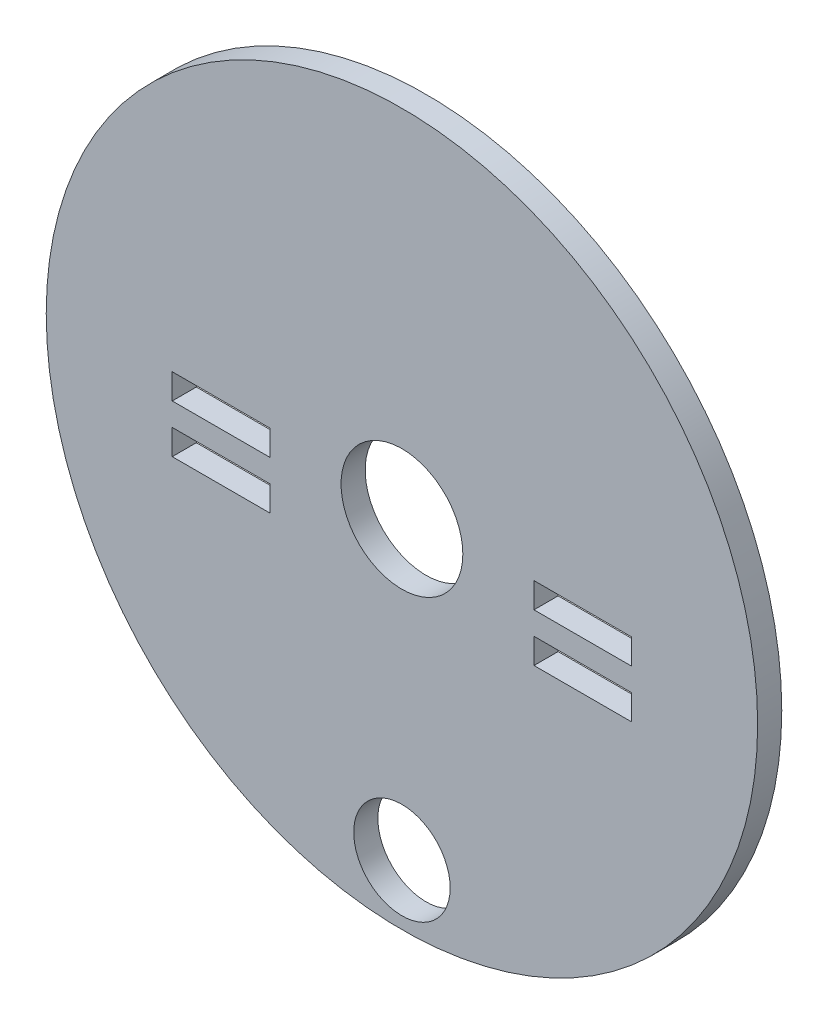
ISO-10303-21;
HEADER;
FILE_DESCRIPTION(('STEP AP214'),'2;1');
FILE_NAME('part.step','',(''),(''),'','','');
FILE_SCHEMA(('AUTOMOTIVE_DESIGN { 1 0 10303 214 1 1 1 1 }'));
ENDSEC;
DATA;
#1=APPLICATION_CONTEXT('core data for automotive mechanical design processes');
#2=APPLICATION_PROTOCOL_DEFINITION('international standard','automotive_design',2000,#1);
#3=PRODUCT_CONTEXT('',#1,'mechanical');
#4=PRODUCT('Part','Part','',(#3));
#5=PRODUCT_RELATED_PRODUCT_CATEGORY('part','',(#4));
#6=PRODUCT_DEFINITION_FORMATION('','',#4);
#7=PRODUCT_DEFINITION_CONTEXT('part definition',#1,'design');
#8=PRODUCT_DEFINITION('design','',#6,#7);
#9=PRODUCT_DEFINITION_SHAPE('','',#8);
#10=(LENGTH_UNIT() NAMED_UNIT(*) SI_UNIT(.MILLI.,.METRE.));
#11=(NAMED_UNIT(*) PLANE_ANGLE_UNIT() SI_UNIT($,.RADIAN.));
#12=(NAMED_UNIT(*) SI_UNIT($,.STERADIAN.) SOLID_ANGLE_UNIT());
#13=UNCERTAINTY_MEASURE_WITH_UNIT(LENGTH_MEASURE(1.E-05),#10,'distance_accuracy_value','');
#14=(GEOMETRIC_REPRESENTATION_CONTEXT(3) GLOBAL_UNCERTAINTY_ASSIGNED_CONTEXT((#13)) GLOBAL_UNIT_ASSIGNED_CONTEXT((#10,
#11,#12)) REPRESENTATION_CONTEXT('',''));
#15=CARTESIAN_POINT('',(0.,0.,0.));
#16=DIRECTION('',(0.,0.,1.));
#17=DIRECTION('',(1.,0.,0.));
#18=AXIS2_PLACEMENT_3D('',#15,#16,#17);
#19=CARTESIAN_POINT('',(0.,4.,2.));
#20=DIRECTION('',(0.,0.,1.));
#21=DIRECTION('',(1.,0.,0.));
#22=AXIS2_PLACEMENT_3D('',#19,#20,#21);
#23=PLANE('',#22);
#24=CARTESIAN_POINT('',(0.,-20.5,2.));
#25=DIRECTION('',(0.,0.,1.));
#26=DIRECTION('',(1.,0.,0.));
#27=AXIS2_PLACEMENT_3D('',#24,#25,#26);
#28=CIRCLE('',#27,4.);
#29=CARTESIAN_POINT('',(4.,-20.5,2.));
#30=VERTEX_POINT('',#29);
#31=EDGE_CURVE('E177',#30,#30,#28,.T.);
#32=ORIENTED_EDGE('',*,*,#31,.F.);
#33=EDGE_LOOP('',(#32));
#34=FACE_BOUND('',#33,.T.);
#35=CARTESIAN_POINT('',(0.,4.,2.));
#36=DIRECTION('',(0.,0.,1.));
#37=DIRECTION('',(1.,0.,0.));
#38=AXIS2_PLACEMENT_3D('',#35,#36,#37);
#39=CIRCLE('',#38,29.5);
#40=CARTESIAN_POINT('',(29.5,4.,2.));
#41=VERTEX_POINT('',#40);
#42=EDGE_CURVE('E11',#41,#41,#39,.T.);
#43=ORIENTED_EDGE('',*,*,#42,.T.);
#44=EDGE_LOOP('',(#43));
#45=FACE_BOUND('',#44,.T.);
#46=DIRECTION('',(-1.,0.,0.));
#47=VECTOR('',#46,1.);
#48=CARTESIAN_POINT('',(-19.05,5.05,2.));
#49=LINE('',#48,#47);
#50=CARTESIAN_POINT('',(-10.95,5.05,2.));
#51=VERTEX_POINT('',#50);
#52=CARTESIAN_POINT('',(-19.05,5.05,2.));
#53=VERTEX_POINT('',#52);
#54=EDGE_CURVE('E251',#51,#53,#49,.T.);
#55=ORIENTED_EDGE('',*,*,#54,.F.);
#56=DIRECTION('',(0.,1.,0.));
#57=VECTOR('',#56,1.);
#58=CARTESIAN_POINT('',(-10.95,5.05,2.));
#59=LINE('',#58,#57);
#60=CARTESIAN_POINT('',(-10.95,2.95,2.));
#61=VERTEX_POINT('',#60);
#62=EDGE_CURVE('E249',#61,#51,#59,.T.);
#63=ORIENTED_EDGE('',*,*,#62,.F.);
#64=DIRECTION('',(1.,0.,0.));
#65=VECTOR('',#64,1.);
#66=CARTESIAN_POINT('',(-19.05,2.95,2.));
#67=LINE('',#66,#65);
#68=CARTESIAN_POINT('',(-19.05,2.95,2.));
#69=VERTEX_POINT('',#68);
#70=EDGE_CURVE('E257',#69,#61,#67,.T.);
#71=ORIENTED_EDGE('',*,*,#70,.F.);
#72=DIRECTION('',(0.,-1.,0.));
#73=VECTOR('',#72,1.);
#74=CARTESIAN_POINT('',(-19.05,5.05,2.));
#75=LINE('',#74,#73);
#76=EDGE_CURVE('E254',#53,#69,#75,.T.);
#77=ORIENTED_EDGE('',*,*,#76,.F.);
#78=EDGE_LOOP('',(#55,#63,#71,#77));
#79=FACE_BOUND('',#78,.T.);
#80=DIRECTION('',(0.,1.,0.));
#81=VECTOR('',#80,1.);
#82=CARTESIAN_POINT('',(-10.95,-1.05,2.));
#83=LINE('',#82,#81);
#84=CARTESIAN_POINT('',(-10.95,-1.05,2.));
#85=VERTEX_POINT('',#84);
#86=CARTESIAN_POINT('',(-10.95,1.05,2.));
#87=VERTEX_POINT('',#86);
#88=EDGE_CURVE('E220',#85,#87,#83,.T.);
#89=ORIENTED_EDGE('',*,*,#88,.F.);
#90=DIRECTION('',(1.,0.,0.));
#91=VECTOR('',#90,1.);
#92=CARTESIAN_POINT('',(-19.05,-1.05,2.));
#93=LINE('',#92,#91);
#94=CARTESIAN_POINT('',(-19.05,-1.05,2.));
#95=VERTEX_POINT('',#94);
#96=EDGE_CURVE('E218',#95,#85,#93,.T.);
#97=ORIENTED_EDGE('',*,*,#96,.F.);
#98=DIRECTION('',(0.,-1.,0.));
#99=VECTOR('',#98,1.);
#100=CARTESIAN_POINT('',(-19.05,-1.05,2.));
#101=LINE('',#100,#99);
#102=CARTESIAN_POINT('',(-19.05,1.05,2.));
#103=VERTEX_POINT('',#102);
#104=EDGE_CURVE('E226',#103,#95,#101,.T.);
#105=ORIENTED_EDGE('',*,*,#104,.F.);
#106=DIRECTION('',(-1.,0.,0.));
#107=VECTOR('',#106,1.);
#108=CARTESIAN_POINT('',(-19.05,1.05,2.));
#109=LINE('',#108,#107);
#110=EDGE_CURVE('E223',#87,#103,#109,.T.);
#111=ORIENTED_EDGE('',*,*,#110,.F.);
#112=EDGE_LOOP('',(#89,#97,#105,#111));
#113=FACE_BOUND('',#112,.T.);
#114=DIRECTION('',(0.,-1.,0.));
#115=VECTOR('',#114,1.);
#116=CARTESIAN_POINT('',(10.95,5.05,2.));
#117=LINE('',#116,#115);
#118=CARTESIAN_POINT('',(10.95,5.05,2.));
#119=VERTEX_POINT('',#118);
#120=CARTESIAN_POINT('',(10.95,2.95,2.));
#121=VERTEX_POINT('',#120);
#122=EDGE_CURVE('E189',#119,#121,#117,.T.);
#123=ORIENTED_EDGE('',*,*,#122,.F.);
#124=DIRECTION('',(-1.,0.,0.));
#125=VECTOR('',#124,1.);
#126=CARTESIAN_POINT('',(19.05,5.05000000000001,2.));
#127=LINE('',#126,#125);
#128=CARTESIAN_POINT('',(19.05,5.05000000000001,2.));
#129=VERTEX_POINT('',#128);
#130=EDGE_CURVE('E187',#129,#119,#127,.T.);
#131=ORIENTED_EDGE('',*,*,#130,.F.);
#132=DIRECTION('',(0.,1.,0.));
#133=VECTOR('',#132,1.);
#134=CARTESIAN_POINT('',(19.05,5.05000000000001,2.));
#135=LINE('',#134,#133);
#136=CARTESIAN_POINT('',(19.05,2.95000000000001,2.));
#137=VERTEX_POINT('',#136);
#138=EDGE_CURVE('E195',#137,#129,#135,.T.);
#139=ORIENTED_EDGE('',*,*,#138,.F.);
#140=DIRECTION('',(1.,0.,0.));
#141=VECTOR('',#140,1.);
#142=CARTESIAN_POINT('',(19.05,2.95000000000001,2.));
#143=LINE('',#142,#141);
#144=EDGE_CURVE('E192',#121,#137,#143,.T.);
#145=ORIENTED_EDGE('',*,*,#144,.F.);
#146=EDGE_LOOP('',(#123,#131,#139,#145));
#147=FACE_BOUND('',#146,.T.);
#148=DIRECTION('',(-1.,0.,0.));
#149=VECTOR('',#148,1.);
#150=CARTESIAN_POINT('',(19.05,1.05,2.));
#151=LINE('',#150,#149);
#152=CARTESIAN_POINT('',(19.05,1.05,2.));
#153=VERTEX_POINT('',#152);
#154=CARTESIAN_POINT('',(10.95,1.05,2.));
#155=VERTEX_POINT('',#154);
#156=EDGE_CURVE('E156',#153,#155,#151,.T.);
#157=ORIENTED_EDGE('',*,*,#156,.F.);
#158=DIRECTION('',(0.,1.,0.));
#159=VECTOR('',#158,1.);
#160=CARTESIAN_POINT('',(19.05,-1.05,2.));
#161=LINE('',#160,#159);
#162=CARTESIAN_POINT('',(19.05,-1.05,2.));
#163=VERTEX_POINT('',#162);
#164=EDGE_CURVE('E148',#163,#153,#161,.T.);
#165=ORIENTED_EDGE('',*,*,#164,.F.);
#166=DIRECTION('',(1.,0.,0.));
#167=VECTOR('',#166,1.);
#168=CARTESIAN_POINT('',(19.05,-1.05,2.));
#169=LINE('',#168,#167);
#170=CARTESIAN_POINT('',(10.95,-1.05,2.));
#171=VERTEX_POINT('',#170);
#172=EDGE_CURVE('E171',#171,#163,#169,.T.);
#173=ORIENTED_EDGE('',*,*,#172,.F.);
#174=DIRECTION('',(0.,-1.,0.));
#175=VECTOR('',#174,1.);
#176=CARTESIAN_POINT('',(10.95,-1.05,2.));
#177=LINE('',#176,#175);
#178=EDGE_CURVE('E169',#155,#171,#177,.T.);
#179=ORIENTED_EDGE('',*,*,#178,.F.);
#180=EDGE_LOOP('',(#157,#165,#173,#179));
#181=FACE_BOUND('',#180,.T.);
#182=CARTESIAN_POINT('',(0.,4.,2.));
#183=DIRECTION('',(0.,0.,1.));
#184=DIRECTION('',(1.,0.,0.));
#185=AXIS2_PLACEMENT_3D('',#182,#183,#184);
#186=CIRCLE('',#185,5.05);
#187=CARTESIAN_POINT('',(5.05,4.,2.));
#188=VERTEX_POINT('',#187);
#189=EDGE_CURVE('E298',#188,#188,#186,.T.);
#190=ORIENTED_EDGE('',*,*,#189,.F.);
#191=EDGE_LOOP('',(#190));
#192=FACE_BOUND('',#191,.T.);
#193=ADVANCED_FACE('F35',(#34,#45,#79,#113,#147,#181,#192),#23,.T.);
#194=CARTESIAN_POINT('',(0.,4.,0.));
#195=DIRECTION('',(0.,0.,1.));
#196=DIRECTION('',(1.,0.,0.));
#197=AXIS2_PLACEMENT_3D('',#194,#195,#196);
#198=PLANE('',#197);
#199=DIRECTION('',(-1.,0.,0.));
#200=VECTOR('',#199,1.);
#201=CARTESIAN_POINT('',(19.05,5.05000000000001,0.));
#202=LINE('',#201,#200);
#203=CARTESIAN_POINT('',(19.05,5.05000000000001,0.));
#204=VERTEX_POINT('',#203);
#205=CARTESIAN_POINT('',(10.95,5.05,0.));
#206=VERTEX_POINT('',#205);
#207=EDGE_CURVE('E164',#204,#206,#202,.T.);
#208=ORIENTED_EDGE('',*,*,#207,.T.);
#209=DIRECTION('',(0.,-1.,0.));
#210=VECTOR('',#209,1.);
#211=CARTESIAN_POINT('',(10.95,5.05,0.));
#212=LINE('',#211,#210);
#213=CARTESIAN_POINT('',(10.95,2.95,0.));
#214=VERTEX_POINT('',#213);
#215=EDGE_CURVE('E200',#206,#214,#212,.T.);
#216=ORIENTED_EDGE('',*,*,#215,.T.);
#217=DIRECTION('',(1.,0.,0.));
#218=VECTOR('',#217,1.);
#219=CARTESIAN_POINT('',(19.05,2.95000000000001,0.));
#220=LINE('',#219,#218);
#221=CARTESIAN_POINT('',(19.05,2.95000000000001,0.));
#222=VERTEX_POINT('',#221);
#223=EDGE_CURVE('E203',#214,#222,#220,.T.);
#224=ORIENTED_EDGE('',*,*,#223,.T.);
#225=DIRECTION('',(0.,1.,0.));
#226=VECTOR('',#225,1.);
#227=CARTESIAN_POINT('',(19.05,5.05000000000001,0.));
#228=LINE('',#227,#226);
#229=EDGE_CURVE('E190',#222,#204,#228,.T.);
#230=ORIENTED_EDGE('',*,*,#229,.T.);
#231=EDGE_LOOP('',(#208,#216,#224,#230));
#232=FACE_BOUND('',#231,.T.);
#233=DIRECTION('',(0.,1.,0.));
#234=VECTOR('',#233,1.);
#235=CARTESIAN_POINT('',(-10.95,5.05,0.));
#236=LINE('',#235,#234);
#237=CARTESIAN_POINT('',(-10.95,2.95,0.));
#238=VERTEX_POINT('',#237);
#239=CARTESIAN_POINT('',(-10.95,5.05,0.));
#240=VERTEX_POINT('',#239);
#241=EDGE_CURVE('E248',#238,#240,#236,.T.);
#242=ORIENTED_EDGE('',*,*,#241,.T.);
#243=DIRECTION('',(-1.,0.,0.));
#244=VECTOR('',#243,1.);
#245=CARTESIAN_POINT('',(-19.05,5.05,0.));
#246=LINE('',#245,#244);
#247=CARTESIAN_POINT('',(-19.05,5.05,0.));
#248=VERTEX_POINT('',#247);
#249=EDGE_CURVE('E262',#240,#248,#246,.T.);
#250=ORIENTED_EDGE('',*,*,#249,.T.);
#251=DIRECTION('',(0.,-1.,0.));
#252=VECTOR('',#251,1.);
#253=CARTESIAN_POINT('',(-19.05,5.05,0.));
#254=LINE('',#253,#252);
#255=CARTESIAN_POINT('',(-19.05,2.95,0.));
#256=VERTEX_POINT('',#255);
#257=EDGE_CURVE('E265',#248,#256,#254,.T.);
#258=ORIENTED_EDGE('',*,*,#257,.T.);
#259=DIRECTION('',(1.,0.,0.));
#260=VECTOR('',#259,1.);
#261=CARTESIAN_POINT('',(-19.05,2.95,0.));
#262=LINE('',#261,#260);
#263=EDGE_CURVE('E252',#256,#238,#262,.T.);
#264=ORIENTED_EDGE('',*,*,#263,.T.);
#265=EDGE_LOOP('',(#242,#250,#258,#264));
#266=FACE_BOUND('',#265,.T.);
#267=CARTESIAN_POINT('',(0.,4.,0.));
#268=DIRECTION('',(0.,0.,1.));
#269=DIRECTION('',(1.,0.,0.));
#270=AXIS2_PLACEMENT_3D('',#267,#268,#269);
#271=CIRCLE('',#270,29.5);
#272=CARTESIAN_POINT('',(29.5,4.,0.));
#273=VERTEX_POINT('',#272);
#274=EDGE_CURVE('E39',#273,#273,#271,.T.);
#275=ORIENTED_EDGE('',*,*,#274,.F.);
#276=EDGE_LOOP('',(#275));
#277=FACE_BOUND('',#276,.T.);
#278=DIRECTION('',(1.,0.,0.));
#279=VECTOR('',#278,1.);
#280=CARTESIAN_POINT('',(-19.05,-1.05,0.));
#281=LINE('',#280,#279);
#282=CARTESIAN_POINT('',(-19.05,-1.05,0.));
#283=VERTEX_POINT('',#282);
#284=CARTESIAN_POINT('',(-10.95,-1.05,0.));
#285=VERTEX_POINT('',#284);
#286=EDGE_CURVE('E217',#283,#285,#281,.T.);
#287=ORIENTED_EDGE('',*,*,#286,.T.);
#288=DIRECTION('',(0.,1.,0.));
#289=VECTOR('',#288,1.);
#290=CARTESIAN_POINT('',(-10.95,-1.05,0.));
#291=LINE('',#290,#289);
#292=CARTESIAN_POINT('',(-10.95,1.05,0.));
#293=VERTEX_POINT('',#292);
#294=EDGE_CURVE('E231',#285,#293,#291,.T.);
#295=ORIENTED_EDGE('',*,*,#294,.T.);
#296=DIRECTION('',(-1.,0.,0.));
#297=VECTOR('',#296,1.);
#298=CARTESIAN_POINT('',(-19.05,1.05,0.));
#299=LINE('',#298,#297);
#300=CARTESIAN_POINT('',(-19.05,1.05,0.));
#301=VERTEX_POINT('',#300);
#302=EDGE_CURVE('E234',#293,#301,#299,.T.);
#303=ORIENTED_EDGE('',*,*,#302,.T.);
#304=DIRECTION('',(0.,-1.,0.));
#305=VECTOR('',#304,1.);
#306=CARTESIAN_POINT('',(-19.05,-1.05,0.));
#307=LINE('',#306,#305);
#308=EDGE_CURVE('E221',#301,#283,#307,.T.);
#309=ORIENTED_EDGE('',*,*,#308,.T.);
#310=EDGE_LOOP('',(#287,#295,#303,#309));
#311=FACE_BOUND('',#310,.T.);
#312=DIRECTION('',(0.,1.,0.));
#313=VECTOR('',#312,1.);
#314=CARTESIAN_POINT('',(19.05,-1.05,0.));
#315=LINE('',#314,#313);
#316=CARTESIAN_POINT('',(19.05,-1.05,0.));
#317=VERTEX_POINT('',#316);
#318=CARTESIAN_POINT('',(19.05,1.05,0.));
#319=VERTEX_POINT('',#318);
#320=EDGE_CURVE('E58',#317,#319,#315,.T.);
#321=ORIENTED_EDGE('',*,*,#320,.T.);
#322=DIRECTION('',(-1.,0.,0.));
#323=VECTOR('',#322,1.);
#324=CARTESIAN_POINT('',(19.05,1.05,0.));
#325=LINE('',#324,#323);
#326=CARTESIAN_POINT('',(10.95,1.05,0.));
#327=VERTEX_POINT('',#326);
#328=EDGE_CURVE('E163',#319,#327,#325,.T.);
#329=ORIENTED_EDGE('',*,*,#328,.T.);
#330=DIRECTION('',(0.,-1.,0.));
#331=VECTOR('',#330,1.);
#332=CARTESIAN_POINT('',(10.95,-1.05,0.));
#333=LINE('',#332,#331);
#334=CARTESIAN_POINT('',(10.95,-1.05,0.));
#335=VERTEX_POINT('',#334);
#336=EDGE_CURVE('E179',#327,#335,#333,.T.);
#337=ORIENTED_EDGE('',*,*,#336,.T.);
#338=DIRECTION('',(1.,0.,0.));
#339=VECTOR('',#338,1.);
#340=CARTESIAN_POINT('',(19.05,-1.05,0.));
#341=LINE('',#340,#339);
#342=EDGE_CURVE('E157',#335,#317,#341,.T.);
#343=ORIENTED_EDGE('',*,*,#342,.T.);
#344=EDGE_LOOP('',(#321,#329,#337,#343));
#345=FACE_BOUND('',#344,.T.);
#346=CARTESIAN_POINT('',(0.,-20.5,0.));
#347=DIRECTION('',(0.,0.,1.));
#348=DIRECTION('',(1.,0.,0.));
#349=AXIS2_PLACEMENT_3D('',#346,#347,#348);
#350=CIRCLE('',#349,4.);
#351=CARTESIAN_POINT('',(4.,-20.5,0.));
#352=VERTEX_POINT('',#351);
#353=EDGE_CURVE('E293',#352,#352,#350,.T.);
#354=ORIENTED_EDGE('',*,*,#353,.T.);
#355=EDGE_LOOP('',(#354));
#356=FACE_BOUND('',#355,.T.);
#357=CARTESIAN_POINT('',(0.,4.,0.));
#358=DIRECTION('',(0.,0.,1.));
#359=DIRECTION('',(1.,0.,0.));
#360=AXIS2_PLACEMENT_3D('',#357,#358,#359);
#361=CIRCLE('',#360,5.05);
#362=CARTESIAN_POINT('',(5.05,4.,0.));
#363=VERTEX_POINT('',#362);
#364=EDGE_CURVE('E296',#363,#363,#361,.T.);
#365=ORIENTED_EDGE('',*,*,#364,.T.);
#366=EDGE_LOOP('',(#365));
#367=FACE_BOUND('',#366,.T.);
#368=ADVANCED_FACE('F284',(#232,#266,#277,#311,#345,#356,#367),#198,.F.);
#369=CARTESIAN_POINT('',(0.,4.,2.));
#370=DIRECTION('',(0.,0.,-1.));
#371=DIRECTION('',(-1.,0.,0.));
#372=AXIS2_PLACEMENT_3D('',#369,#370,#371);
#373=CYLINDRICAL_SURFACE('',#372,29.5);
#374=ORIENTED_EDGE('',*,*,#42,.F.);
#375=EDGE_LOOP('',(#374));
#376=FACE_BOUND('',#375,.T.);
#377=ORIENTED_EDGE('',*,*,#274,.T.);
#378=EDGE_LOOP('',(#377));
#379=FACE_BOUND('',#378,.T.);
#380=ADVANCED_FACE('F37',(#376,#379),#373,.T.);
#381=CARTESIAN_POINT('',(-10.95,5.05,2.));
#382=DIRECTION('',(-1.,0.,0.));
#383=DIRECTION('',(0.,0.,1.));
#384=AXIS2_PLACEMENT_3D('',#381,#382,#383);
#385=PLANE('',#384);
#386=ORIENTED_EDGE('',*,*,#241,.F.);
#387=DIRECTION('',(0.,0.,-1.));
#388=VECTOR('',#387,1.);
#389=CARTESIAN_POINT('',(-10.95,2.95,2.));
#390=LINE('',#389,#388);
#391=EDGE_CURVE('E259',#61,#238,#390,.T.);
#392=ORIENTED_EDGE('',*,*,#391,.F.);
#393=ORIENTED_EDGE('',*,*,#62,.T.);
#394=DIRECTION('',(0.,0.,-1.));
#395=VECTOR('',#394,1.);
#396=CARTESIAN_POINT('',(-10.95,5.05,2.));
#397=LINE('',#396,#395);
#398=EDGE_CURVE('E276',#51,#240,#397,.T.);
#399=ORIENTED_EDGE('',*,*,#398,.T.);
#400=EDGE_LOOP('',(#386,#392,#393,#399));
#401=FACE_BOUND('',#400,.T.);
#402=ADVANCED_FACE('F381',(#401),#385,.T.);
#403=CARTESIAN_POINT('',(-19.05,5.05,2.));
#404=DIRECTION('',(0.,-1.,0.));
#405=DIRECTION('',(0.,0.,-1.));
#406=AXIS2_PLACEMENT_3D('',#403,#404,#405);
#407=PLANE('',#406);
#408=ORIENTED_EDGE('',*,*,#249,.F.);
#409=ORIENTED_EDGE('',*,*,#398,.F.);
#410=ORIENTED_EDGE('',*,*,#54,.T.);
#411=DIRECTION('',(0.,0.,-1.));
#412=VECTOR('',#411,1.);
#413=CARTESIAN_POINT('',(-19.05,5.05,2.));
#414=LINE('',#413,#412);
#415=EDGE_CURVE('E274',#53,#248,#414,.T.);
#416=ORIENTED_EDGE('',*,*,#415,.T.);
#417=EDGE_LOOP('',(#408,#409,#410,#416));
#418=FACE_BOUND('',#417,.T.);
#419=ADVANCED_FACE('F377',(#418),#407,.T.);
#420=CARTESIAN_POINT('',(-19.05,5.05,2.));
#421=DIRECTION('',(1.,0.,0.));
#422=DIRECTION('',(0.,0.,-1.));
#423=AXIS2_PLACEMENT_3D('',#420,#421,#422);
#424=PLANE('',#423);
#425=ORIENTED_EDGE('',*,*,#257,.F.);
#426=ORIENTED_EDGE('',*,*,#415,.F.);
#427=ORIENTED_EDGE('',*,*,#76,.T.);
#428=DIRECTION('',(0.,0.,-1.));
#429=VECTOR('',#428,1.);
#430=CARTESIAN_POINT('',(-19.05,2.95,2.));
#431=LINE('',#430,#429);
#432=EDGE_CURVE('E272',#69,#256,#431,.T.);
#433=ORIENTED_EDGE('',*,*,#432,.T.);
#434=EDGE_LOOP('',(#425,#426,#427,#433));
#435=FACE_BOUND('',#434,.T.);
#436=ADVANCED_FACE('F373',(#435),#424,.T.);
#437=CARTESIAN_POINT('',(-19.05,2.95,2.));
#438=DIRECTION('',(0.,1.,0.));
#439=DIRECTION('',(0.,0.,1.));
#440=AXIS2_PLACEMENT_3D('',#437,#438,#439);
#441=PLANE('',#440);
#442=ORIENTED_EDGE('',*,*,#263,.F.);
#443=ORIENTED_EDGE('',*,*,#432,.F.);
#444=ORIENTED_EDGE('',*,*,#70,.T.);
#445=ORIENTED_EDGE('',*,*,#391,.T.);
#446=EDGE_LOOP('',(#442,#443,#444,#445));
#447=FACE_BOUND('',#446,.T.);
#448=ADVANCED_FACE('F369',(#447),#441,.T.);
#449=CARTESIAN_POINT('',(-19.05,-1.05,2.));
#450=DIRECTION('',(0.,1.,0.));
#451=DIRECTION('',(0.,0.,1.));
#452=AXIS2_PLACEMENT_3D('',#449,#450,#451);
#453=PLANE('',#452);
#454=ORIENTED_EDGE('',*,*,#286,.F.);
#455=DIRECTION('',(0.,0.,-1.));
#456=VECTOR('',#455,1.);
#457=CARTESIAN_POINT('',(-19.05,-1.05,2.));
#458=LINE('',#457,#456);
#459=EDGE_CURVE('E228',#95,#283,#458,.T.);
#460=ORIENTED_EDGE('',*,*,#459,.F.);
#461=ORIENTED_EDGE('',*,*,#96,.T.);
#462=DIRECTION('',(0.,0.,-1.));
#463=VECTOR('',#462,1.);
#464=CARTESIAN_POINT('',(-10.95,-1.05,2.));
#465=LINE('',#464,#463);
#466=EDGE_CURVE('E245',#85,#285,#465,.T.);
#467=ORIENTED_EDGE('',*,*,#466,.T.);
#468=EDGE_LOOP('',(#454,#460,#461,#467));
#469=FACE_BOUND('',#468,.T.);
#470=ADVANCED_FACE('F365',(#469),#453,.T.);
#471=CARTESIAN_POINT('',(-10.95,-1.05,2.));
#472=DIRECTION('',(-1.,0.,0.));
#473=DIRECTION('',(0.,0.,1.));
#474=AXIS2_PLACEMENT_3D('',#471,#472,#473);
#475=PLANE('',#474);
#476=ORIENTED_EDGE('',*,*,#294,.F.);
#477=ORIENTED_EDGE('',*,*,#466,.F.);
#478=ORIENTED_EDGE('',*,*,#88,.T.);
#479=DIRECTION('',(0.,0.,-1.));
#480=VECTOR('',#479,1.);
#481=CARTESIAN_POINT('',(-10.95,1.05,2.));
#482=LINE('',#481,#480);
#483=EDGE_CURVE('E243',#87,#293,#482,.T.);
#484=ORIENTED_EDGE('',*,*,#483,.T.);
#485=EDGE_LOOP('',(#476,#477,#478,#484));
#486=FACE_BOUND('',#485,.T.);
#487=ADVANCED_FACE('F361',(#486),#475,.T.);
#488=CARTESIAN_POINT('',(-19.05,1.05,2.));
#489=DIRECTION('',(0.,-1.,0.));
#490=DIRECTION('',(0.,0.,-1.));
#491=AXIS2_PLACEMENT_3D('',#488,#489,#490);
#492=PLANE('',#491);
#493=ORIENTED_EDGE('',*,*,#302,.F.);
#494=ORIENTED_EDGE('',*,*,#483,.F.);
#495=ORIENTED_EDGE('',*,*,#110,.T.);
#496=DIRECTION('',(0.,0.,-1.));
#497=VECTOR('',#496,1.);
#498=CARTESIAN_POINT('',(-19.05,1.05,2.));
#499=LINE('',#498,#497);
#500=EDGE_CURVE('E241',#103,#301,#499,.T.);
#501=ORIENTED_EDGE('',*,*,#500,.T.);
#502=EDGE_LOOP('',(#493,#494,#495,#501));
#503=FACE_BOUND('',#502,.T.);
#504=ADVANCED_FACE('F357',(#503),#492,.T.);
#505=CARTESIAN_POINT('',(-19.05,-1.05,2.));
#506=DIRECTION('',(1.,0.,0.));
#507=DIRECTION('',(0.,0.,-1.));
#508=AXIS2_PLACEMENT_3D('',#505,#506,#507);
#509=PLANE('',#508);
#510=ORIENTED_EDGE('',*,*,#308,.F.);
#511=ORIENTED_EDGE('',*,*,#500,.F.);
#512=ORIENTED_EDGE('',*,*,#104,.T.);
#513=ORIENTED_EDGE('',*,*,#459,.T.);
#514=EDGE_LOOP('',(#510,#511,#512,#513));
#515=FACE_BOUND('',#514,.T.);
#516=ADVANCED_FACE('F354',(#515),#509,.T.);
#517=CARTESIAN_POINT('',(19.05,5.05000000000001,2.));
#518=DIRECTION('',(0.,-1.,0.));
#519=DIRECTION('',(1.,0.,0.));
#520=AXIS2_PLACEMENT_3D('',#517,#518,#519);
#521=PLANE('',#520);
#522=ORIENTED_EDGE('',*,*,#207,.F.);
#523=DIRECTION('',(0.,0.,-1.));
#524=VECTOR('',#523,1.);
#525=CARTESIAN_POINT('',(19.05,5.05000000000001,2.));
#526=LINE('',#525,#524);
#527=EDGE_CURVE('E197',#129,#204,#526,.T.);
#528=ORIENTED_EDGE('',*,*,#527,.F.);
#529=ORIENTED_EDGE('',*,*,#130,.T.);
#530=DIRECTION('',(0.,0.,-1.));
#531=VECTOR('',#530,1.);
#532=CARTESIAN_POINT('',(10.95,5.05,2.));
#533=LINE('',#532,#531);
#534=EDGE_CURVE('E214',#119,#206,#533,.T.);
#535=ORIENTED_EDGE('',*,*,#534,.T.);
#536=EDGE_LOOP('',(#522,#528,#529,#535));
#537=FACE_BOUND('',#536,.T.);
#538=ADVANCED_FACE('F336',(#537),#521,.T.);
#539=CARTESIAN_POINT('',(10.95,5.05,2.));
#540=DIRECTION('',(1.,0.,0.));
#541=DIRECTION('',(0.,0.,-1.));
#542=AXIS2_PLACEMENT_3D('',#539,#540,#541);
#543=PLANE('',#542);
#544=ORIENTED_EDGE('',*,*,#215,.F.);
#545=ORIENTED_EDGE('',*,*,#534,.F.);
#546=ORIENTED_EDGE('',*,*,#122,.T.);
#547=DIRECTION('',(0.,0.,-1.));
#548=VECTOR('',#547,1.);
#549=CARTESIAN_POINT('',(10.95,2.95,2.));
#550=LINE('',#549,#548);
#551=EDGE_CURVE('E212',#121,#214,#550,.T.);
#552=ORIENTED_EDGE('',*,*,#551,.T.);
#553=EDGE_LOOP('',(#544,#545,#546,#552));
#554=FACE_BOUND('',#553,.T.);
#555=ADVANCED_FACE('F329',(#554),#543,.T.);
#556=CARTESIAN_POINT('',(19.05,2.95000000000001,2.));
#557=DIRECTION('',(0.,1.,0.));
#558=DIRECTION('',(-1.,0.,0.));
#559=AXIS2_PLACEMENT_3D('',#556,#557,#558);
#560=PLANE('',#559);
#561=ORIENTED_EDGE('',*,*,#223,.F.);
#562=ORIENTED_EDGE('',*,*,#551,.F.);
#563=ORIENTED_EDGE('',*,*,#144,.T.);
#564=DIRECTION('',(0.,0.,-1.));
#565=VECTOR('',#564,1.);
#566=CARTESIAN_POINT('',(19.05,2.95000000000001,2.));
#567=LINE('',#566,#565);
#568=EDGE_CURVE('E210',#137,#222,#567,.T.);
#569=ORIENTED_EDGE('',*,*,#568,.T.);
#570=EDGE_LOOP('',(#561,#562,#563,#569));
#571=FACE_BOUND('',#570,.T.);
#572=ADVANCED_FACE('F332',(#571),#560,.T.);
#573=CARTESIAN_POINT('',(19.05,5.05000000000001,2.));
#574=DIRECTION('',(-1.,0.,0.));
#575=DIRECTION('',(0.,0.,1.));
#576=AXIS2_PLACEMENT_3D('',#573,#574,#575);
#577=PLANE('',#576);
#578=ORIENTED_EDGE('',*,*,#229,.F.);
#579=ORIENTED_EDGE('',*,*,#568,.F.);
#580=ORIENTED_EDGE('',*,*,#138,.T.);
#581=ORIENTED_EDGE('',*,*,#527,.T.);
#582=EDGE_LOOP('',(#578,#579,#580,#581));
#583=FACE_BOUND('',#582,.T.);
#584=ADVANCED_FACE('F339',(#583),#577,.T.);
#585=CARTESIAN_POINT('',(19.05,-1.05,2.));
#586=DIRECTION('',(-1.,0.,0.));
#587=DIRECTION('',(0.,0.,1.));
#588=AXIS2_PLACEMENT_3D('',#585,#586,#587);
#589=PLANE('',#588);
#590=ORIENTED_EDGE('',*,*,#320,.F.);
#591=DIRECTION('',(0.,0.,-1.));
#592=VECTOR('',#591,1.);
#593=CARTESIAN_POINT('',(19.05,-1.05,2.));
#594=LINE('',#593,#592);
#595=EDGE_CURVE('E152',#163,#317,#594,.T.);
#596=ORIENTED_EDGE('',*,*,#595,.F.);
#597=ORIENTED_EDGE('',*,*,#164,.T.);
#598=DIRECTION('',(0.,0.,-1.));
#599=VECTOR('',#598,1.);
#600=CARTESIAN_POINT('',(19.05,1.05,2.));
#601=LINE('',#600,#599);
#602=EDGE_CURVE('E151',#153,#319,#601,.T.);
#603=ORIENTED_EDGE('',*,*,#602,.T.);
#604=EDGE_LOOP('',(#590,#596,#597,#603));
#605=FACE_BOUND('',#604,.T.);
#606=ADVANCED_FACE('F150',(#605),#589,.T.);
#607=CARTESIAN_POINT('',(19.05,1.05,2.));
#608=DIRECTION('',(0.,-1.,0.));
#609=DIRECTION('',(0.,0.,-1.));
#610=AXIS2_PLACEMENT_3D('',#607,#608,#609);
#611=PLANE('',#610);
#612=ORIENTED_EDGE('',*,*,#328,.F.);
#613=ORIENTED_EDGE('',*,*,#602,.F.);
#614=ORIENTED_EDGE('',*,*,#156,.T.);
#615=DIRECTION('',(0.,0.,-1.));
#616=VECTOR('',#615,1.);
#617=CARTESIAN_POINT('',(10.95,1.05,2.));
#618=LINE('',#617,#616);
#619=EDGE_CURVE('E165',#155,#327,#618,.T.);
#620=ORIENTED_EDGE('',*,*,#619,.T.);
#621=EDGE_LOOP('',(#612,#613,#614,#620));
#622=FACE_BOUND('',#621,.T.);
#623=ADVANCED_FACE('F160',(#622),#611,.T.);
#624=CARTESIAN_POINT('',(10.95,-1.05,2.));
#625=DIRECTION('',(1.,0.,0.));
#626=DIRECTION('',(0.,0.,-1.));
#627=AXIS2_PLACEMENT_3D('',#624,#625,#626);
#628=PLANE('',#627);
#629=ORIENTED_EDGE('',*,*,#336,.F.);
#630=ORIENTED_EDGE('',*,*,#619,.F.);
#631=ORIENTED_EDGE('',*,*,#178,.T.);
#632=DIRECTION('',(0.,0.,-1.));
#633=VECTOR('',#632,1.);
#634=CARTESIAN_POINT('',(10.95,-1.05,2.));
#635=LINE('',#634,#633);
#636=EDGE_CURVE('E50',#171,#335,#635,.T.);
#637=ORIENTED_EDGE('',*,*,#636,.T.);
#638=EDGE_LOOP('',(#629,#630,#631,#637));
#639=FACE_BOUND('',#638,.T.);
#640=ADVANCED_FACE('F480',(#639),#628,.T.);
#641=CARTESIAN_POINT('',(19.05,-1.05,2.));
#642=DIRECTION('',(0.,1.,0.));
#643=DIRECTION('',(0.,0.,1.));
#644=AXIS2_PLACEMENT_3D('',#641,#642,#643);
#645=PLANE('',#644);
#646=ORIENTED_EDGE('',*,*,#342,.F.);
#647=ORIENTED_EDGE('',*,*,#636,.F.);
#648=ORIENTED_EDGE('',*,*,#172,.T.);
#649=ORIENTED_EDGE('',*,*,#595,.T.);
#650=EDGE_LOOP('',(#646,#647,#648,#649));
#651=FACE_BOUND('',#650,.T.);
#652=ADVANCED_FACE('F487',(#651),#645,.T.);
#653=CARTESIAN_POINT('',(0.,-20.5,2.));
#654=DIRECTION('',(0.,0.,-1.));
#655=DIRECTION('',(-1.,0.,0.));
#656=AXIS2_PLACEMENT_3D('',#653,#654,#655);
#657=CYLINDRICAL_SURFACE('',#656,4.);
#658=ORIENTED_EDGE('',*,*,#31,.T.);
#659=EDGE_LOOP('',(#658));
#660=FACE_BOUND('',#659,.T.);
#661=ORIENTED_EDGE('',*,*,#353,.F.);
#662=EDGE_LOOP('',(#661));
#663=FACE_BOUND('',#662,.T.);
#664=ADVANCED_FACE('F306',(#660,#663),#657,.F.);
#665=CARTESIAN_POINT('',(0.,4.,2.));
#666=DIRECTION('',(0.,0.,-1.));
#667=DIRECTION('',(-1.,0.,0.));
#668=AXIS2_PLACEMENT_3D('',#665,#666,#667);
#669=CYLINDRICAL_SURFACE('',#668,5.05);
#670=ORIENTED_EDGE('',*,*,#189,.T.);
#671=EDGE_LOOP('',(#670));
#672=FACE_BOUND('',#671,.T.);
#673=ORIENTED_EDGE('',*,*,#364,.F.);
#674=EDGE_LOOP('',(#673));
#675=FACE_BOUND('',#674,.T.);
#676=ADVANCED_FACE('F503',(#672,#675),#669,.F.);
#677=CLOSED_SHELL('',(#193,#368,#380,#402,#419,#436,#448,#470,#487,#504,#516,#538,#555,#572,
#584,#606,#623,#640,#652,#664,#676));
#678=MANIFOLD_SOLID_BREP('B2',#677);
#679=ADVANCED_BREP_SHAPE_REPRESENTATION('',(#18,#678),#14);
#680=SHAPE_DEFINITION_REPRESENTATION(#9,#679);
ENDSEC;
END-ISO-10303-21;
